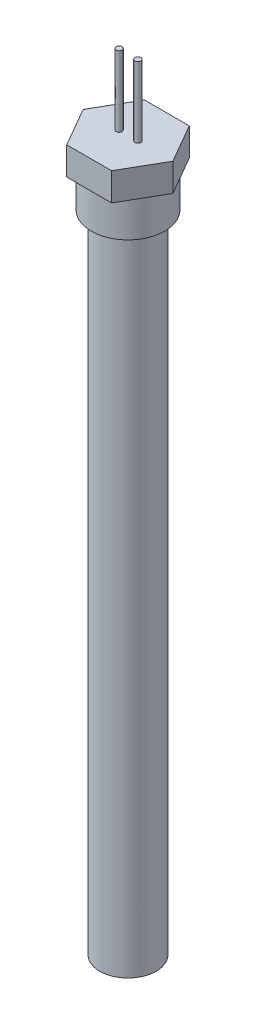
ISO-10303-21;
HEADER;
FILE_DESCRIPTION(('STEP AP214'),'2;1');
FILE_NAME('part.step','',(''),(''),'','','');
FILE_SCHEMA(('AUTOMOTIVE_DESIGN { 1 0 10303 214 1 1 1 1 }'));
ENDSEC;
DATA;
#1=APPLICATION_CONTEXT('core data for automotive mechanical design processes');
#2=APPLICATION_PROTOCOL_DEFINITION('international standard','automotive_design',2000,#1);
#3=PRODUCT_CONTEXT('',#1,'mechanical');
#4=PRODUCT('Part','Part','',(#3));
#5=PRODUCT_RELATED_PRODUCT_CATEGORY('part','',(#4));
#6=PRODUCT_DEFINITION_FORMATION('','',#4);
#7=PRODUCT_DEFINITION_CONTEXT('part definition',#1,'design');
#8=PRODUCT_DEFINITION('design','',#6,#7);
#9=PRODUCT_DEFINITION_SHAPE('','',#8);
#10=(LENGTH_UNIT() NAMED_UNIT(*) SI_UNIT(.MILLI.,.METRE.));
#11=(NAMED_UNIT(*) PLANE_ANGLE_UNIT() SI_UNIT($,.RADIAN.));
#12=(NAMED_UNIT(*) SI_UNIT($,.STERADIAN.) SOLID_ANGLE_UNIT());
#13=UNCERTAINTY_MEASURE_WITH_UNIT(LENGTH_MEASURE(1.E-05),#10,'distance_accuracy_value','');
#14=(GEOMETRIC_REPRESENTATION_CONTEXT(3) GLOBAL_UNCERTAINTY_ASSIGNED_CONTEXT((#13)) GLOBAL_UNIT_ASSIGNED_CONTEXT((#10,
#11,#12)) REPRESENTATION_CONTEXT('',''));
#15=CARTESIAN_POINT('',(0.,0.,0.));
#16=DIRECTION('',(0.,0.,1.));
#17=DIRECTION('',(1.,0.,0.));
#18=AXIS2_PLACEMENT_3D('',#15,#16,#17);
#19=CARTESIAN_POINT('',(0.,193.1,0.));
#20=DIRECTION('',(0.,1.,0.));
#21=DIRECTION('',(0.,0.,1.));
#22=AXIS2_PLACEMENT_3D('',#19,#20,#21);
#23=PLANE('',#22);
#24=DIRECTION('',(0.5,0.,-0.866025403784438));
#25=VECTOR('',#24,1.);
#26=CARTESIAN_POINT('',(6.35085296108589,193.1,11.));
#27=LINE('',#26,#25);
#28=CARTESIAN_POINT('',(6.35085296108589,193.1,11.));
#29=VERTEX_POINT('',#28);
#30=CARTESIAN_POINT('',(12.7017059221718,193.1,0.));
#31=VERTEX_POINT('',#30);
#32=EDGE_CURVE('E140',#29,#31,#27,.T.);
#33=ORIENTED_EDGE('',*,*,#32,.F.);
#34=DIRECTION('',(1.,0.,0.));
#35=VECTOR('',#34,1.);
#36=CARTESIAN_POINT('',(-6.35085296108588,193.1,11.));
#37=LINE('',#36,#35);
#38=CARTESIAN_POINT('',(-6.35085296108588,193.1,11.));
#39=VERTEX_POINT('',#38);
#40=EDGE_CURVE('E114',#39,#29,#37,.T.);
#41=ORIENTED_EDGE('',*,*,#40,.F.);
#42=DIRECTION('',(0.5,0.,0.866025403784438));
#43=VECTOR('',#42,1.);
#44=CARTESIAN_POINT('',(-12.7017059221718,193.1,0.));
#45=LINE('',#44,#43);
#46=CARTESIAN_POINT('',(-12.7017059221718,193.1,0.));
#47=VERTEX_POINT('',#46);
#48=EDGE_CURVE('E99',#47,#39,#45,.T.);
#49=ORIENTED_EDGE('',*,*,#48,.F.);
#50=DIRECTION('',(-0.5,0.,0.866025403784439));
#51=VECTOR('',#50,1.);
#52=CARTESIAN_POINT('',(-6.35085296108588,193.1,-11.));
#53=LINE('',#52,#51);
#54=CARTESIAN_POINT('',(-6.35085296108588,193.1,-11.));
#55=VERTEX_POINT('',#54);
#56=EDGE_CURVE('E112',#55,#47,#53,.T.);
#57=ORIENTED_EDGE('',*,*,#56,.F.);
#58=DIRECTION('',(-1.,0.,0.));
#59=VECTOR('',#58,1.);
#60=CARTESIAN_POINT('',(6.35085296108588,193.1,-11.));
#61=LINE('',#60,#59);
#62=CARTESIAN_POINT('',(6.35085296108588,193.1,-11.));
#63=VERTEX_POINT('',#62);
#64=EDGE_CURVE('E117',#63,#55,#61,.T.);
#65=ORIENTED_EDGE('',*,*,#64,.F.);
#66=DIRECTION('',(-0.5,0.,-0.866025403784438));
#67=VECTOR('',#66,1.);
#68=CARTESIAN_POINT('',(12.7017059221718,193.1,0.));
#69=LINE('',#68,#67);
#70=EDGE_CURVE('E119',#31,#63,#69,.T.);
#71=ORIENTED_EDGE('',*,*,#70,.F.);
#72=EDGE_LOOP('',(#33,#41,#49,#57,#65,#71));
#73=FACE_BOUND('',#72,.T.);
#74=CARTESIAN_POINT('',(0.,193.1,0.));
#75=DIRECTION('',(0.,1.,0.));
#76=DIRECTION('',(0.,0.,1.));
#77=AXIS2_PLACEMENT_3D('',#74,#75,#76);
#78=CIRCLE('',#77,10.4);
#79=CARTESIAN_POINT('',(0.,193.1,10.4));
#80=VERTEX_POINT('',#79);
#81=EDGE_CURVE('E11',#80,#80,#78,.F.);
#82=ORIENTED_EDGE('',*,*,#81,.F.);
#83=EDGE_LOOP('',(#82));
#84=FACE_BOUND('',#83,.T.);
#85=ADVANCED_FACE('F36',(#73,#84),#23,.F.);
#86=CARTESIAN_POINT('',(0.,201.,0.));
#87=DIRECTION('',(0.,1.,0.));
#88=DIRECTION('',(0.,0.,1.));
#89=AXIS2_PLACEMENT_3D('',#86,#87,#88);
#90=PLANE('',#89);
#91=CARTESIAN_POINT('',(2.75004572435695,201.,-0.0666677751364678));
#92=DIRECTION('',(0.,1.,0.));
#93=DIRECTION('',(0.,0.,1.));
#94=AXIS2_PLACEMENT_3D('',#91,#92,#93);
#95=CIRCLE('',#94,0.842670194883671);
#96=CARTESIAN_POINT('',(2.75004572435695,201.,0.776002419747203));
#97=VERTEX_POINT('',#96);
#98=EDGE_CURVE('E142',#97,#97,#95,.T.);
#99=ORIENTED_EDGE('',*,*,#98,.F.);
#100=EDGE_LOOP('',(#99));
#101=FACE_BOUND('',#100,.T.);
#102=CARTESIAN_POINT('',(-2.57504281462514,201.,-0.0666677751364678));
#103=DIRECTION('',(0.,1.,0.));
#104=DIRECTION('',(0.,0.,1.));
#105=AXIS2_PLACEMENT_3D('',#102,#103,#104);
#106=CIRCLE('',#105,0.828373933707974);
#107=CARTESIAN_POINT('',(-2.57504281462514,201.,0.761706158571506));
#108=VERTEX_POINT('',#107);
#109=EDGE_CURVE('E151',#108,#108,#106,.T.);
#110=ORIENTED_EDGE('',*,*,#109,.F.);
#111=EDGE_LOOP('',(#110));
#112=FACE_BOUND('',#111,.T.);
#113=DIRECTION('',(0.5,0.,-0.866025403784438));
#114=VECTOR('',#113,1.);
#115=CARTESIAN_POINT('',(6.35085296108589,201.,11.));
#116=LINE('',#115,#114);
#117=CARTESIAN_POINT('',(6.35085296108589,201.,11.));
#118=VERTEX_POINT('',#117);
#119=CARTESIAN_POINT('',(12.7017059221718,201.,0.));
#120=VERTEX_POINT('',#119);
#121=EDGE_CURVE('E124',#118,#120,#116,.T.);
#122=ORIENTED_EDGE('',*,*,#121,.T.);
#123=DIRECTION('',(-0.5,0.,-0.866025403784438));
#124=VECTOR('',#123,1.);
#125=CARTESIAN_POINT('',(12.7017059221718,201.,0.));
#126=LINE('',#125,#124);
#127=CARTESIAN_POINT('',(6.35085296108588,201.,-11.));
#128=VERTEX_POINT('',#127);
#129=EDGE_CURVE('E127',#120,#128,#126,.T.);
#130=ORIENTED_EDGE('',*,*,#129,.T.);
#131=DIRECTION('',(-1.,0.,0.));
#132=VECTOR('',#131,1.);
#133=CARTESIAN_POINT('',(6.35085296108588,201.,-11.));
#134=LINE('',#133,#132);
#135=CARTESIAN_POINT('',(-6.35085296108588,201.,-11.));
#136=VERTEX_POINT('',#135);
#137=EDGE_CURVE('E131',#128,#136,#134,.T.);
#138=ORIENTED_EDGE('',*,*,#137,.T.);
#139=DIRECTION('',(-0.5,0.,0.866025403784439));
#140=VECTOR('',#139,1.);
#141=CARTESIAN_POINT('',(-6.35085296108588,201.,-11.));
#142=LINE('',#141,#140);
#143=CARTESIAN_POINT('',(-12.7017059221718,201.,0.));
#144=VERTEX_POINT('',#143);
#145=EDGE_CURVE('E134',#136,#144,#142,.T.);
#146=ORIENTED_EDGE('',*,*,#145,.T.);
#147=DIRECTION('',(0.5,0.,0.866025403784438));
#148=VECTOR('',#147,1.);
#149=CARTESIAN_POINT('',(-12.7017059221718,201.,0.));
#150=LINE('',#149,#148);
#151=CARTESIAN_POINT('',(-6.35085296108588,201.,11.));
#152=VERTEX_POINT('',#151);
#153=EDGE_CURVE('E101',#144,#152,#150,.T.);
#154=ORIENTED_EDGE('',*,*,#153,.T.);
#155=DIRECTION('',(1.,0.,0.));
#156=VECTOR('',#155,1.);
#157=CARTESIAN_POINT('',(-6.35085296108588,201.,11.));
#158=LINE('',#157,#156);
#159=EDGE_CURVE('E137',#152,#118,#158,.T.);
#160=ORIENTED_EDGE('',*,*,#159,.T.);
#161=EDGE_LOOP('',(#122,#130,#138,#146,#154,#160));
#162=FACE_BOUND('',#161,.T.);
#163=ADVANCED_FACE('F175',(#101,#112,#162),#90,.T.);
#164=CARTESIAN_POINT('',(-2.57504281462514,221.,-0.0666677751364678));
#165=DIRECTION('',(0.,-1.,0.));
#166=DIRECTION('',(0.,0.,-1.));
#167=AXIS2_PLACEMENT_3D('',#164,#165,#166);
#168=CYLINDRICAL_SURFACE('',#167,0.828373933707974);
#169=CARTESIAN_POINT('',(-2.57504281462514,221.,-0.0666677751364678));
#170=DIRECTION('',(0.,1.,0.));
#171=DIRECTION('',(0.,0.,1.));
#172=AXIS2_PLACEMENT_3D('',#169,#170,#171);
#173=CIRCLE('',#172,0.828373933707974);
#174=CARTESIAN_POINT('',(-2.57504281462514,221.,0.761706158571506));
#175=VERTEX_POINT('',#174);
#176=EDGE_CURVE('E154',#175,#175,#173,.T.);
#177=ORIENTED_EDGE('',*,*,#176,.F.);
#178=EDGE_LOOP('',(#177));
#179=FACE_BOUND('',#178,.T.);
#180=ORIENTED_EDGE('',*,*,#109,.T.);
#181=EDGE_LOOP('',(#180));
#182=FACE_BOUND('',#181,.T.);
#183=ADVANCED_FACE('F180',(#179,#182),#168,.T.);
#184=CARTESIAN_POINT('',(-2.57504281462514,221.,-0.0666677751364678));
#185=DIRECTION('',(0.,1.,0.));
#186=DIRECTION('',(0.,0.,1.));
#187=AXIS2_PLACEMENT_3D('',#184,#185,#186);
#188=PLANE('',#187);
#189=ORIENTED_EDGE('',*,*,#176,.T.);
#190=EDGE_LOOP('',(#189));
#191=FACE_BOUND('',#190,.T.);
#192=ADVANCED_FACE('F208',(#191),#188,.T.);
#193=CARTESIAN_POINT('',(2.75004572435695,221.,-0.0666677751364678));
#194=DIRECTION('',(0.,-1.,0.));
#195=DIRECTION('',(0.,0.,-1.));
#196=AXIS2_PLACEMENT_3D('',#193,#194,#195);
#197=CYLINDRICAL_SURFACE('',#196,0.842670194883671);
#198=CARTESIAN_POINT('',(2.75004572435695,221.,-0.0666677751364678));
#199=DIRECTION('',(0.,1.,0.));
#200=DIRECTION('',(0.,0.,1.));
#201=AXIS2_PLACEMENT_3D('',#198,#199,#200);
#202=CIRCLE('',#201,0.842670194883671);
#203=CARTESIAN_POINT('',(2.75004572435695,221.,0.776002419747203));
#204=VERTEX_POINT('',#203);
#205=EDGE_CURVE('E148',#204,#204,#202,.T.);
#206=ORIENTED_EDGE('',*,*,#205,.F.);
#207=EDGE_LOOP('',(#206));
#208=FACE_BOUND('',#207,.T.);
#209=ORIENTED_EDGE('',*,*,#98,.T.);
#210=EDGE_LOOP('',(#209));
#211=FACE_BOUND('',#210,.T.);
#212=ADVANCED_FACE('F204',(#208,#211),#197,.T.);
#213=CARTESIAN_POINT('',(2.75004572435695,221.,-0.0666677751364678));
#214=DIRECTION('',(0.,1.,0.));
#215=DIRECTION('',(0.,0.,1.));
#216=AXIS2_PLACEMENT_3D('',#213,#214,#215);
#217=PLANE('',#216);
#218=ORIENTED_EDGE('',*,*,#205,.T.);
#219=EDGE_LOOP('',(#218));
#220=FACE_BOUND('',#219,.T.);
#221=ADVANCED_FACE('F201',(#220),#217,.T.);
#222=CARTESIAN_POINT('',(6.35085296108589,193.1,11.));
#223=DIRECTION('',(0.866025403784439,0.,0.5));
#224=DIRECTION('',(0.5,0.,-0.866025403784439));
#225=AXIS2_PLACEMENT_3D('',#222,#223,#224);
#226=PLANE('',#225);
#227=ORIENTED_EDGE('',*,*,#121,.F.);
#228=DIRECTION('',(0.,1.,0.));
#229=VECTOR('',#228,1.);
#230=CARTESIAN_POINT('',(6.35085296108589,193.1,11.));
#231=LINE('',#230,#229);
#232=EDGE_CURVE('E53',#29,#118,#231,.T.);
#233=ORIENTED_EDGE('',*,*,#232,.F.);
#234=ORIENTED_EDGE('',*,*,#32,.T.);
#235=DIRECTION('',(0.,1.,0.));
#236=VECTOR('',#235,1.);
#237=CARTESIAN_POINT('',(12.7017059221718,193.1,0.));
#238=LINE('',#237,#236);
#239=EDGE_CURVE('E88',#31,#120,#238,.T.);
#240=ORIENTED_EDGE('',*,*,#239,.T.);
#241=EDGE_LOOP('',(#227,#233,#234,#240));
#242=FACE_BOUND('',#241,.T.);
#243=ADVANCED_FACE('F187',(#242),#226,.T.);
#244=CARTESIAN_POINT('',(-6.35085296108588,193.1,11.));
#245=DIRECTION('',(0.,0.,1.));
#246=DIRECTION('',(1.,0.,0.));
#247=AXIS2_PLACEMENT_3D('',#244,#245,#246);
#248=PLANE('',#247);
#249=ORIENTED_EDGE('',*,*,#159,.F.);
#250=DIRECTION('',(0.,1.,0.));
#251=VECTOR('',#250,1.);
#252=CARTESIAN_POINT('',(-6.35085296108588,193.1,11.));
#253=LINE('',#252,#251);
#254=EDGE_CURVE('E76',#39,#152,#253,.T.);
#255=ORIENTED_EDGE('',*,*,#254,.F.);
#256=ORIENTED_EDGE('',*,*,#40,.T.);
#257=ORIENTED_EDGE('',*,*,#232,.T.);
#258=EDGE_LOOP('',(#249,#255,#256,#257));
#259=FACE_BOUND('',#258,.T.);
#260=ADVANCED_FACE('F184',(#259),#248,.T.);
#261=CARTESIAN_POINT('',(-12.7017059221718,193.1,0.));
#262=DIRECTION('',(-0.866025403784438,0.,0.5));
#263=DIRECTION('',(0.5,0.,0.866025403784438));
#264=AXIS2_PLACEMENT_3D('',#261,#262,#263);
#265=PLANE('',#264);
#266=ORIENTED_EDGE('',*,*,#153,.F.);
#267=DIRECTION('',(0.,1.,0.));
#268=VECTOR('',#267,1.);
#269=CARTESIAN_POINT('',(-12.7017059221718,193.1,0.));
#270=LINE('',#269,#268);
#271=EDGE_CURVE('E96',#47,#144,#270,.T.);
#272=ORIENTED_EDGE('',*,*,#271,.F.);
#273=ORIENTED_EDGE('',*,*,#48,.T.);
#274=ORIENTED_EDGE('',*,*,#254,.T.);
#275=EDGE_LOOP('',(#266,#272,#273,#274));
#276=FACE_BOUND('',#275,.T.);
#277=ADVANCED_FACE('F98',(#276),#265,.T.);
#278=CARTESIAN_POINT('',(-6.35085296108588,193.1,-11.));
#279=DIRECTION('',(-0.866025403784439,0.,-0.5));
#280=DIRECTION('',(-0.5,0.,0.866025403784439));
#281=AXIS2_PLACEMENT_3D('',#278,#279,#280);
#282=PLANE('',#281);
#283=ORIENTED_EDGE('',*,*,#145,.F.);
#284=DIRECTION('',(0.,1.,0.));
#285=VECTOR('',#284,1.);
#286=CARTESIAN_POINT('',(-6.35085296108588,193.1,-11.));
#287=LINE('',#286,#285);
#288=EDGE_CURVE('E106',#55,#136,#287,.T.);
#289=ORIENTED_EDGE('',*,*,#288,.F.);
#290=ORIENTED_EDGE('',*,*,#56,.T.);
#291=ORIENTED_EDGE('',*,*,#271,.T.);
#292=EDGE_LOOP('',(#283,#289,#290,#291));
#293=FACE_BOUND('',#292,.T.);
#294=ADVANCED_FACE('F116',(#293),#282,.T.);
#295=CARTESIAN_POINT('',(6.35085296108588,193.1,-11.));
#296=DIRECTION('',(0.,0.,-1.));
#297=DIRECTION('',(-1.,0.,0.));
#298=AXIS2_PLACEMENT_3D('',#295,#296,#297);
#299=PLANE('',#298);
#300=ORIENTED_EDGE('',*,*,#137,.F.);
#301=DIRECTION('',(0.,1.,0.));
#302=VECTOR('',#301,1.);
#303=CARTESIAN_POINT('',(6.35085296108588,193.1,-11.));
#304=LINE('',#303,#302);
#305=EDGE_CURVE('E145',#63,#128,#304,.T.);
#306=ORIENTED_EDGE('',*,*,#305,.F.);
#307=ORIENTED_EDGE('',*,*,#64,.T.);
#308=ORIENTED_EDGE('',*,*,#288,.T.);
#309=EDGE_LOOP('',(#300,#306,#307,#308));
#310=FACE_BOUND('',#309,.T.);
#311=ADVANCED_FACE('F192',(#310),#299,.T.);
#312=CARTESIAN_POINT('',(12.7017059221718,193.1,0.));
#313=DIRECTION('',(0.866025403784439,0.,-0.5));
#314=DIRECTION('',(-0.5,0.,-0.866025403784438));
#315=AXIS2_PLACEMENT_3D('',#312,#313,#314);
#316=PLANE('',#315);
#317=ORIENTED_EDGE('',*,*,#129,.F.);
#318=ORIENTED_EDGE('',*,*,#239,.F.);
#319=ORIENTED_EDGE('',*,*,#70,.T.);
#320=ORIENTED_EDGE('',*,*,#305,.T.);
#321=EDGE_LOOP('',(#317,#318,#319,#320));
#322=FACE_BOUND('',#321,.T.);
#323=ADVANCED_FACE('F195',(#322),#316,.T.);
#324=CARTESIAN_POINT('',(0.,182.7,0.));
#325=DIRECTION('',(0.,-1.,0.));
#326=DIRECTION('',(0.,0.,-1.));
#327=AXIS2_PLACEMENT_3D('',#324,#325,#326);
#328=PLANE('',#327);
#329=CARTESIAN_POINT('',(0.,182.7,0.));
#330=DIRECTION('',(0.,-1.,0.));
#331=DIRECTION('',(0.,0.,-1.));
#332=AXIS2_PLACEMENT_3D('',#329,#330,#331);
#333=CIRCLE('',#332,10.4);
#334=CARTESIAN_POINT('',(0.,182.7,-10.4));
#335=VERTEX_POINT('',#334);
#336=EDGE_CURVE('E128',#335,#335,#333,.T.);
#337=ORIENTED_EDGE('',*,*,#336,.T.);
#338=EDGE_LOOP('',(#337));
#339=FACE_BOUND('',#338,.T.);
#340=CARTESIAN_POINT('',(0.,182.7,0.));
#341=DIRECTION('',(0.,-1.,0.));
#342=DIRECTION('',(0.,0.,-1.));
#343=AXIS2_PLACEMENT_3D('',#340,#341,#342);
#344=CIRCLE('',#343,8.);
#345=CARTESIAN_POINT('',(0.,182.7,-8.));
#346=VERTEX_POINT('',#345);
#347=EDGE_CURVE('E227',#346,#346,#344,.T.);
#348=ORIENTED_EDGE('',*,*,#347,.F.);
#349=EDGE_LOOP('',(#348));
#350=FACE_BOUND('',#349,.T.);
#351=ADVANCED_FACE('F170',(#339,#350),#328,.T.);
#352=CARTESIAN_POINT('',(0.,182.7,0.));
#353=DIRECTION('',(0.,1.,0.));
#354=DIRECTION('',(0.,0.,1.));
#355=AXIS2_PLACEMENT_3D('',#352,#353,#354);
#356=CYLINDRICAL_SURFACE('',#355,10.4);
#357=ORIENTED_EDGE('',*,*,#336,.F.);
#358=EDGE_LOOP('',(#357));
#359=FACE_BOUND('',#358,.T.);
#360=ORIENTED_EDGE('',*,*,#81,.T.);
#361=EDGE_LOOP('',(#360));
#362=FACE_BOUND('',#361,.T.);
#363=ADVANCED_FACE('F164',(#359,#362),#356,.T.);
#364=CARTESIAN_POINT('',(0.,0.,0.));
#365=DIRECTION('',(0.,1.,0.));
#366=DIRECTION('',(0.,0.,1.));
#367=AXIS2_PLACEMENT_3D('',#364,#365,#366);
#368=PLANE('',#367);
#369=CARTESIAN_POINT('',(0.,0.,0.));
#370=DIRECTION('',(0.,1.,0.));
#371=DIRECTION('',(0.,0.,1.));
#372=AXIS2_PLACEMENT_3D('',#369,#370,#371);
#373=CIRCLE('',#372,8.);
#374=CARTESIAN_POINT('',(0.,0.,8.));
#375=VERTEX_POINT('',#374);
#376=EDGE_CURVE('E45',#375,#375,#373,.T.);
#377=ORIENTED_EDGE('',*,*,#376,.F.);
#378=EDGE_LOOP('',(#377));
#379=FACE_BOUND('',#378,.T.);
#380=ADVANCED_FACE('F162',(#379),#368,.F.);
#381=CARTESIAN_POINT('',(0.,201.,0.));
#382=DIRECTION('',(0.,-1.,0.));
#383=DIRECTION('',(0.,0.,-1.));
#384=AXIS2_PLACEMENT_3D('',#381,#382,#383);
#385=CYLINDRICAL_SURFACE('',#384,8.);
#386=ORIENTED_EDGE('',*,*,#347,.T.);
#387=EDGE_LOOP('',(#386));
#388=FACE_BOUND('',#387,.T.);
#389=ORIENTED_EDGE('',*,*,#376,.T.);
#390=EDGE_LOOP('',(#389));
#391=FACE_BOUND('',#390,.T.);
#392=ADVANCED_FACE('F38',(#388,#391),#385,.T.);
#393=CLOSED_SHELL('',(#85,#163,#183,#192,#212,#221,#243,#260,#277,#294,#311,#323,#351,#363,#380,#392));
#394=MANIFOLD_SOLID_BREP('B2',#393);
#395=ADVANCED_BREP_SHAPE_REPRESENTATION('',(#18,#394),#14);
#396=SHAPE_DEFINITION_REPRESENTATION(#9,#395);
ENDSEC;
END-ISO-10303-21;
